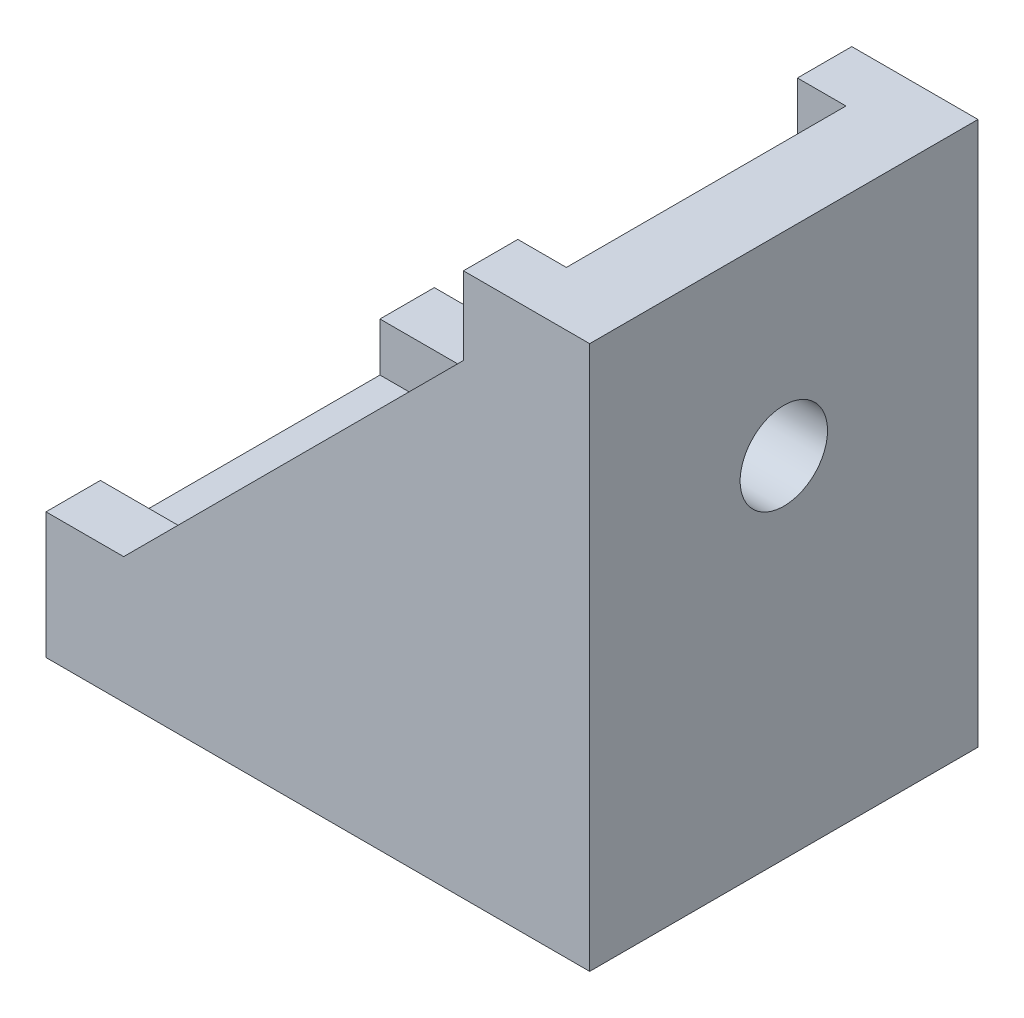
ISO-10303-21;
HEADER;
FILE_DESCRIPTION(('STEP AP214'),'2;1');
FILE_NAME('part.step','',(''),(''),'','','');
FILE_SCHEMA(('AUTOMOTIVE_DESIGN { 1 0 10303 214 1 1 1 1 }'));
ENDSEC;
DATA;
#1=APPLICATION_CONTEXT('core data for automotive mechanical design processes');
#2=APPLICATION_PROTOCOL_DEFINITION('international standard','automotive_design',2000,#1);
#3=PRODUCT_CONTEXT('',#1,'mechanical');
#4=PRODUCT('Part','Part','',(#3));
#5=PRODUCT_RELATED_PRODUCT_CATEGORY('part','',(#4));
#6=PRODUCT_DEFINITION_FORMATION('','',#4);
#7=PRODUCT_DEFINITION_CONTEXT('part definition',#1,'design');
#8=PRODUCT_DEFINITION('design','',#6,#7);
#9=PRODUCT_DEFINITION_SHAPE('','',#8);
#10=(LENGTH_UNIT() NAMED_UNIT(*) SI_UNIT(.MILLI.,.METRE.));
#11=(NAMED_UNIT(*) PLANE_ANGLE_UNIT() SI_UNIT($,.RADIAN.));
#12=(NAMED_UNIT(*) SI_UNIT($,.STERADIAN.) SOLID_ANGLE_UNIT());
#13=UNCERTAINTY_MEASURE_WITH_UNIT(LENGTH_MEASURE(1.E-05),#10,'distance_accuracy_value','');
#14=(GEOMETRIC_REPRESENTATION_CONTEXT(3) GLOBAL_UNCERTAINTY_ASSIGNED_CONTEXT((#13)) GLOBAL_UNIT_ASSIGNED_CONTEXT((#10,
#11,#12)) REPRESENTATION_CONTEXT('',''));
#15=CARTESIAN_POINT('',(0.,0.,0.));
#16=DIRECTION('',(0.,0.,1.));
#17=DIRECTION('',(1.,0.,0.));
#18=AXIS2_PLACEMENT_3D('',#15,#16,#17);
#19=CARTESIAN_POINT('',(21.5,28.,0.));
#20=DIRECTION('',(1.,0.,0.));
#21=DIRECTION('',(0.,0.,-1.));
#22=AXIS2_PLACEMENT_3D('',#19,#20,#21);
#23=PLANE('',#22);
#24=DIRECTION('',(0.,0.,1.));
#25=VECTOR('',#24,1.);
#26=CARTESIAN_POINT('',(21.5,24.0000000000001,0.));
#27=LINE('',#26,#25);
#28=CARTESIAN_POINT('',(21.5,24.0000000000001,0.));
#29=VERTEX_POINT('',#28);
#30=CARTESIAN_POINT('',(21.5,24.0000000000001,2.8));
#31=VERTEX_POINT('',#30);
#32=EDGE_CURVE('E201',#29,#31,#27,.T.);
#33=ORIENTED_EDGE('',*,*,#32,.T.);
#34=DIRECTION('',(0.,1.,0.));
#35=VECTOR('',#34,1.);
#36=CARTESIAN_POINT('',(21.5,28.,2.8));
#37=LINE('',#36,#35);
#38=CARTESIAN_POINT('',(21.5,28.,2.8));
#39=VERTEX_POINT('',#38);
#40=EDGE_CURVE('E177',#31,#39,#37,.T.);
#41=ORIENTED_EDGE('',*,*,#40,.T.);
#42=DIRECTION('',(0.,0.,1.));
#43=VECTOR('',#42,1.);
#44=CARTESIAN_POINT('',(21.5,28.,0.));
#45=LINE('',#44,#43);
#46=CARTESIAN_POINT('',(21.5,28.,0.));
#47=VERTEX_POINT('',#46);
#48=EDGE_CURVE('E196',#47,#39,#45,.T.);
#49=ORIENTED_EDGE('',*,*,#48,.F.);
#50=DIRECTION('',(0.,1.,0.));
#51=VECTOR('',#50,1.);
#52=CARTESIAN_POINT('',(21.5,28.,0.));
#53=LINE('',#52,#51);
#54=EDGE_CURVE('E186',#29,#47,#53,.T.);
#55=ORIENTED_EDGE('',*,*,#54,.F.);
#56=EDGE_LOOP('',(#33,#41,#49,#55));
#57=FACE_BOUND('',#56,.T.);
#58=ADVANCED_FACE('F36',(#57),#23,.F.);
#59=CARTESIAN_POINT('',(21.5,24.0000000000001,0.));
#60=DIRECTION('',(0.707106781186549,-0.707106781186546,0.));
#61=DIRECTION('',(0.707106781186546,0.707106781186549,0.));
#62=AXIS2_PLACEMENT_3D('',#59,#60,#61);
#63=PLANE('',#62);
#64=DIRECTION('',(0.,0.,1.));
#65=VECTOR('',#64,1.);
#66=CARTESIAN_POINT('',(4.,6.5,0.));
#67=LINE('',#66,#65);
#68=CARTESIAN_POINT('',(4.,6.5,0.));
#69=VERTEX_POINT('',#68);
#70=CARTESIAN_POINT('',(4.,6.5,2.8));
#71=VERTEX_POINT('',#70);
#72=EDGE_CURVE('E205',#69,#71,#67,.T.);
#73=ORIENTED_EDGE('',*,*,#72,.T.);
#74=DIRECTION('',(0.707106781186546,0.707106781186549,0.));
#75=VECTOR('',#74,1.);
#76=CARTESIAN_POINT('',(21.5,24.0000000000001,2.8));
#77=LINE('',#76,#75);
#78=EDGE_CURVE('E174',#71,#31,#77,.T.);
#79=ORIENTED_EDGE('',*,*,#78,.T.);
#80=ORIENTED_EDGE('',*,*,#32,.F.);
#81=DIRECTION('',(0.707106781186546,0.707106781186549,0.));
#82=VECTOR('',#81,1.);
#83=CARTESIAN_POINT('',(21.5,24.0000000000001,0.));
#84=LINE('',#83,#82);
#85=EDGE_CURVE('E61',#69,#29,#84,.T.);
#86=ORIENTED_EDGE('',*,*,#85,.F.);
#87=EDGE_LOOP('',(#73,#79,#80,#86));
#88=FACE_BOUND('',#87,.T.);
#89=ADVANCED_FACE('F278',(#88),#63,.F.);
#90=CARTESIAN_POINT('',(4.,6.5,0.));
#91=DIRECTION('',(0.,-1.,0.));
#92=DIRECTION('',(1.,0.,0.));
#93=AXIS2_PLACEMENT_3D('',#90,#91,#92);
#94=PLANE('',#93);
#95=DIRECTION('',(0.,0.,1.));
#96=VECTOR('',#95,1.);
#97=CARTESIAN_POINT('',(0.,6.5,0.));
#98=LINE('',#97,#96);
#99=CARTESIAN_POINT('',(0.,6.5,0.));
#100=VERTEX_POINT('',#99);
#101=CARTESIAN_POINT('',(0.,6.5,2.8));
#102=VERTEX_POINT('',#101);
#103=EDGE_CURVE('E208',#100,#102,#98,.T.);
#104=ORIENTED_EDGE('',*,*,#103,.T.);
#105=DIRECTION('',(1.,0.,0.));
#106=VECTOR('',#105,1.);
#107=CARTESIAN_POINT('',(4.,6.5,2.8));
#108=LINE('',#107,#106);
#109=EDGE_CURVE('E11',#102,#71,#108,.T.);
#110=ORIENTED_EDGE('',*,*,#109,.T.);
#111=ORIENTED_EDGE('',*,*,#72,.F.);
#112=DIRECTION('',(1.,0.,0.));
#113=VECTOR('',#112,1.);
#114=CARTESIAN_POINT('',(4.,6.5,0.));
#115=LINE('',#114,#113);
#116=EDGE_CURVE('E181',#100,#69,#115,.T.);
#117=ORIENTED_EDGE('',*,*,#116,.F.);
#118=EDGE_LOOP('',(#104,#110,#111,#117));
#119=FACE_BOUND('',#118,.T.);
#120=ADVANCED_FACE('F276',(#119),#94,.F.);
#121=CARTESIAN_POINT('',(0.,0.,20.));
#122=DIRECTION('',(1.,0.,0.));
#123=DIRECTION('',(0.,0.,-1.));
#124=AXIS2_PLACEMENT_3D('',#121,#122,#123);
#125=PLANE('',#124);
#126=DIRECTION('',(0.,0.,1.));
#127=VECTOR('',#126,1.);
#128=CARTESIAN_POINT('',(0.,4.,2.8));
#129=LINE('',#128,#127);
#130=CARTESIAN_POINT('',(0.,4.,2.8));
#131=VERTEX_POINT('',#130);
#132=CARTESIAN_POINT('',(0.,4.,17.2));
#133=VERTEX_POINT('',#132);
#134=EDGE_CURVE('E147',#131,#133,#129,.T.);
#135=ORIENTED_EDGE('',*,*,#134,.F.);
#136=DIRECTION('',(0.,1.,0.));
#137=VECTOR('',#136,1.);
#138=CARTESIAN_POINT('',(0.,4.,2.8));
#139=LINE('',#138,#137);
#140=EDGE_CURVE('E171',#131,#102,#139,.T.);
#141=ORIENTED_EDGE('',*,*,#140,.T.);
#142=ORIENTED_EDGE('',*,*,#103,.F.);
#143=DIRECTION('',(0.,-1.,0.));
#144=VECTOR('',#143,1.);
#145=CARTESIAN_POINT('',(0.,0.,0.));
#146=LINE('',#145,#144);
#147=CARTESIAN_POINT('',(0.,0.,0.));
#148=VERTEX_POINT('',#147);
#149=EDGE_CURVE('E199',#100,#148,#146,.T.);
#150=ORIENTED_EDGE('',*,*,#149,.T.);
#151=DIRECTION('',(0.,0.,-1.));
#152=VECTOR('',#151,1.);
#153=CARTESIAN_POINT('',(0.,0.,20.));
#154=LINE('',#153,#152);
#155=CARTESIAN_POINT('',(0.,0.,20.));
#156=VERTEX_POINT('',#155);
#157=EDGE_CURVE('E234',#156,#148,#154,.T.);
#158=ORIENTED_EDGE('',*,*,#157,.F.);
#159=DIRECTION('',(0.,-1.,0.));
#160=VECTOR('',#159,1.);
#161=CARTESIAN_POINT('',(0.,0.,20.));
#162=LINE('',#161,#160);
#163=CARTESIAN_POINT('',(0.,6.5,20.));
#164=VERTEX_POINT('',#163);
#165=EDGE_CURVE('E211',#164,#156,#162,.T.);
#166=ORIENTED_EDGE('',*,*,#165,.F.);
#167=CARTESIAN_POINT('',(0.,6.5,17.2));
#168=VERTEX_POINT('',#167);
#169=EDGE_CURVE('E160',#168,#164,#98,.T.);
#170=ORIENTED_EDGE('',*,*,#169,.F.);
#171=DIRECTION('',(0.,1.,0.));
#172=VECTOR('',#171,1.);
#173=CARTESIAN_POINT('',(0.,4.,17.2));
#174=LINE('',#173,#172);
#175=EDGE_CURVE('E53',#133,#168,#174,.T.);
#176=ORIENTED_EDGE('',*,*,#175,.F.);
#177=EDGE_LOOP('',(#135,#141,#142,#150,#158,#166,#170,#176));
#178=FACE_BOUND('',#177,.T.);
#179=ADVANCED_FACE('F38',(#178),#125,.F.);
#180=CARTESIAN_POINT('',(0.,0.,20.));
#181=DIRECTION('',(0.,1.,0.));
#182=DIRECTION('',(0.,0.,1.));
#183=AXIS2_PLACEMENT_3D('',#180,#181,#182);
#184=PLANE('',#183);
#185=CARTESIAN_POINT('',(10.,0.,10.));
#186=DIRECTION('',(0.,-1.,0.));
#187=DIRECTION('',(0.,0.,-1.));
#188=AXIS2_PLACEMENT_3D('',#185,#186,#187);
#189=CIRCLE('',#188,2.25);
#190=CARTESIAN_POINT('',(10.,0.,7.75));
#191=VERTEX_POINT('',#190);
#192=EDGE_CURVE('E240',#191,#191,#189,.T.);
#193=ORIENTED_EDGE('',*,*,#192,.F.);
#194=EDGE_LOOP('',(#193));
#195=FACE_BOUND('',#194,.T.);
#196=DIRECTION('',(1.,0.,0.));
#197=VECTOR('',#196,1.);
#198=CARTESIAN_POINT('',(0.,0.,0.));
#199=LINE('',#198,#197);
#200=CARTESIAN_POINT('',(28.,0.,0.));
#201=VERTEX_POINT('',#200);
#202=EDGE_CURVE('E223',#148,#201,#199,.T.);
#203=ORIENTED_EDGE('',*,*,#202,.T.);
#204=DIRECTION('',(0.,0.,-1.));
#205=VECTOR('',#204,1.);
#206=CARTESIAN_POINT('',(28.,0.,20.));
#207=LINE('',#206,#205);
#208=CARTESIAN_POINT('',(28.,0.,20.));
#209=VERTEX_POINT('',#208);
#210=EDGE_CURVE('E231',#209,#201,#207,.T.);
#211=ORIENTED_EDGE('',*,*,#210,.F.);
#212=DIRECTION('',(1.,0.,0.));
#213=VECTOR('',#212,1.);
#214=CARTESIAN_POINT('',(0.,0.,20.));
#215=LINE('',#214,#213);
#216=EDGE_CURVE('E213',#156,#209,#215,.T.);
#217=ORIENTED_EDGE('',*,*,#216,.F.);
#218=ORIENTED_EDGE('',*,*,#157,.T.);
#219=EDGE_LOOP('',(#203,#211,#217,#218));
#220=FACE_BOUND('',#219,.T.);
#221=ADVANCED_FACE('F313',(#195,#220),#184,.F.);
#222=CARTESIAN_POINT('',(28.,0.,20.));
#223=DIRECTION('',(-1.,0.,0.));
#224=DIRECTION('',(0.,0.,1.));
#225=AXIS2_PLACEMENT_3D('',#222,#223,#224);
#226=PLANE('',#225);
#227=CARTESIAN_POINT('',(28.,18.,10.));
#228=DIRECTION('',(1.,0.,0.));
#229=DIRECTION('',(0.,0.,-1.));
#230=AXIS2_PLACEMENT_3D('',#227,#228,#229);
#231=CIRCLE('',#230,2.25);
#232=CARTESIAN_POINT('',(28.,18.,7.75));
#233=VERTEX_POINT('',#232);
#234=EDGE_CURVE('E250',#233,#233,#231,.T.);
#235=ORIENTED_EDGE('',*,*,#234,.F.);
#236=EDGE_LOOP('',(#235));
#237=FACE_BOUND('',#236,.T.);
#238=DIRECTION('',(0.,1.,0.));
#239=VECTOR('',#238,1.);
#240=CARTESIAN_POINT('',(28.,0.,0.));
#241=LINE('',#240,#239);
#242=CARTESIAN_POINT('',(28.,28.,0.));
#243=VERTEX_POINT('',#242);
#244=EDGE_CURVE('E225',#201,#243,#241,.T.);
#245=ORIENTED_EDGE('',*,*,#244,.T.);
#246=DIRECTION('',(0.,0.,-1.));
#247=VECTOR('',#246,1.);
#248=CARTESIAN_POINT('',(28.,28.,20.));
#249=LINE('',#248,#247);
#250=CARTESIAN_POINT('',(28.,28.,20.));
#251=VERTEX_POINT('',#250);
#252=EDGE_CURVE('E221',#251,#243,#249,.T.);
#253=ORIENTED_EDGE('',*,*,#252,.F.);
#254=DIRECTION('',(0.,1.,0.));
#255=VECTOR('',#254,1.);
#256=CARTESIAN_POINT('',(28.,0.,20.));
#257=LINE('',#256,#255);
#258=EDGE_CURVE('E216',#209,#251,#257,.T.);
#259=ORIENTED_EDGE('',*,*,#258,.F.);
#260=ORIENTED_EDGE('',*,*,#210,.T.);
#261=EDGE_LOOP('',(#245,#253,#259,#260));
#262=FACE_BOUND('',#261,.T.);
#263=ADVANCED_FACE('F311',(#237,#262),#226,.F.);
#264=CARTESIAN_POINT('',(0.,28.,20.));
#265=DIRECTION('',(0.,-1.,0.));
#266=DIRECTION('',(0.,0.,-1.));
#267=AXIS2_PLACEMENT_3D('',#264,#265,#266);
#268=PLANE('',#267);
#269=ORIENTED_EDGE('',*,*,#48,.T.);
#270=DIRECTION('',(-1.,0.,0.));
#271=VECTOR('',#270,1.);
#272=CARTESIAN_POINT('',(0.,28.,2.8));
#273=LINE('',#272,#271);
#274=CARTESIAN_POINT('',(24.,28.,2.8));
#275=VERTEX_POINT('',#274);
#276=EDGE_CURVE('E156',#275,#39,#273,.T.);
#277=ORIENTED_EDGE('',*,*,#276,.F.);
#278=DIRECTION('',(0.,0.,-1.));
#279=VECTOR('',#278,1.);
#280=CARTESIAN_POINT('',(24.,28.,2.8));
#281=LINE('',#280,#279);
#282=CARTESIAN_POINT('',(24.,28.,17.2));
#283=VERTEX_POINT('',#282);
#284=EDGE_CURVE('E243',#283,#275,#281,.T.);
#285=ORIENTED_EDGE('',*,*,#284,.F.);
#286=DIRECTION('',(1.,0.,0.));
#287=VECTOR('',#286,1.);
#288=CARTESIAN_POINT('',(0.,28.,17.2));
#289=LINE('',#288,#287);
#290=CARTESIAN_POINT('',(21.5,28.,17.2));
#291=VERTEX_POINT('',#290);
#292=EDGE_CURVE('E239',#291,#283,#289,.T.);
#293=ORIENTED_EDGE('',*,*,#292,.F.);
#294=CARTESIAN_POINT('',(21.5,28.,20.));
#295=VERTEX_POINT('',#294);
#296=EDGE_CURVE('E200',#291,#295,#45,.T.);
#297=ORIENTED_EDGE('',*,*,#296,.T.);
#298=DIRECTION('',(-1.,0.,0.));
#299=VECTOR('',#298,1.);
#300=CARTESIAN_POINT('',(0.,28.,20.));
#301=LINE('',#300,#299);
#302=EDGE_CURVE('E218',#251,#295,#301,.T.);
#303=ORIENTED_EDGE('',*,*,#302,.F.);
#304=ORIENTED_EDGE('',*,*,#252,.T.);
#305=DIRECTION('',(-1.,0.,0.));
#306=VECTOR('',#305,1.);
#307=CARTESIAN_POINT('',(0.,28.,0.));
#308=LINE('',#307,#306);
#309=EDGE_CURVE('E214',#243,#47,#308,.T.);
#310=ORIENTED_EDGE('',*,*,#309,.T.);
#311=EDGE_LOOP('',(#269,#277,#285,#293,#297,#303,#304,#310));
#312=FACE_BOUND('',#311,.T.);
#313=ADVANCED_FACE('F265',(#312),#268,.F.);
#314=CARTESIAN_POINT('',(0.,0.,20.));
#315=DIRECTION('',(0.,0.,-1.));
#316=DIRECTION('',(-1.,0.,0.));
#317=AXIS2_PLACEMENT_3D('',#314,#315,#316);
#318=PLANE('',#317);
#319=ORIENTED_EDGE('',*,*,#302,.T.);
#320=DIRECTION('',(0.,1.,0.));
#321=VECTOR('',#320,1.);
#322=CARTESIAN_POINT('',(21.5,28.,20.));
#323=LINE('',#322,#321);
#324=CARTESIAN_POINT('',(21.5,24.0000000000001,20.));
#325=VERTEX_POINT('',#324);
#326=EDGE_CURVE('E184',#325,#295,#323,.T.);
#327=ORIENTED_EDGE('',*,*,#326,.F.);
#328=DIRECTION('',(0.707106781186546,0.707106781186549,0.));
#329=VECTOR('',#328,1.);
#330=CARTESIAN_POINT('',(21.5,24.0000000000001,20.));
#331=LINE('',#330,#329);
#332=CARTESIAN_POINT('',(4.,6.5,20.));
#333=VERTEX_POINT('',#332);
#334=EDGE_CURVE('E191',#333,#325,#331,.T.);
#335=ORIENTED_EDGE('',*,*,#334,.F.);
#336=DIRECTION('',(1.,0.,0.));
#337=VECTOR('',#336,1.);
#338=CARTESIAN_POINT('',(4.,6.5,20.));
#339=LINE('',#338,#337);
#340=EDGE_CURVE('E180',#164,#333,#339,.T.);
#341=ORIENTED_EDGE('',*,*,#340,.F.);
#342=ORIENTED_EDGE('',*,*,#165,.T.);
#343=ORIENTED_EDGE('',*,*,#216,.T.);
#344=ORIENTED_EDGE('',*,*,#258,.T.);
#345=EDGE_LOOP('',(#319,#327,#335,#341,#342,#343,#344));
#346=FACE_BOUND('',#345,.T.);
#347=ADVANCED_FACE('F306',(#346),#318,.F.);
#348=CARTESIAN_POINT('',(0.,0.,0.));
#349=DIRECTION('',(0.,0.,-1.));
#350=DIRECTION('',(-1.,0.,0.));
#351=AXIS2_PLACEMENT_3D('',#348,#349,#350);
#352=PLANE('',#351);
#353=ORIENTED_EDGE('',*,*,#54,.T.);
#354=ORIENTED_EDGE('',*,*,#309,.F.);
#355=ORIENTED_EDGE('',*,*,#244,.F.);
#356=ORIENTED_EDGE('',*,*,#202,.F.);
#357=ORIENTED_EDGE('',*,*,#149,.F.);
#358=ORIENTED_EDGE('',*,*,#116,.T.);
#359=ORIENTED_EDGE('',*,*,#85,.T.);
#360=EDGE_LOOP('',(#353,#354,#355,#356,#357,#358,#359));
#361=FACE_BOUND('',#360,.T.);
#362=ADVANCED_FACE('F270',(#361),#352,.T.);
#363=ORIENTED_EDGE('',*,*,#296,.F.);
#364=DIRECTION('',(0.,-1.,0.));
#365=VECTOR('',#364,1.);
#366=CARTESIAN_POINT('',(21.5,28.,17.2));
#367=LINE('',#366,#365);
#368=CARTESIAN_POINT('',(21.5,24.0000000000001,17.2));
#369=VERTEX_POINT('',#368);
#370=EDGE_CURVE('E170',#291,#369,#367,.T.);
#371=ORIENTED_EDGE('',*,*,#370,.T.);
#372=EDGE_CURVE('E204',#369,#325,#27,.T.);
#373=ORIENTED_EDGE('',*,*,#372,.T.);
#374=ORIENTED_EDGE('',*,*,#326,.T.);
#375=EDGE_LOOP('',(#363,#371,#373,#374));
#376=FACE_BOUND('',#375,.T.);
#377=ADVANCED_FACE('F289',(#376),#23,.F.);
#378=ORIENTED_EDGE('',*,*,#372,.F.);
#379=DIRECTION('',(-0.707106781186546,-0.707106781186549,0.));
#380=VECTOR('',#379,1.);
#381=CARTESIAN_POINT('',(21.5,24.0000000000001,17.2));
#382=LINE('',#381,#380);
#383=CARTESIAN_POINT('',(4.,6.5,17.2));
#384=VERTEX_POINT('',#383);
#385=EDGE_CURVE('E167',#369,#384,#382,.T.);
#386=ORIENTED_EDGE('',*,*,#385,.T.);
#387=EDGE_CURVE('E207',#384,#333,#67,.T.);
#388=ORIENTED_EDGE('',*,*,#387,.T.);
#389=ORIENTED_EDGE('',*,*,#334,.T.);
#390=EDGE_LOOP('',(#378,#386,#388,#389));
#391=FACE_BOUND('',#390,.T.);
#392=ADVANCED_FACE('F281',(#391),#63,.F.);
#393=ORIENTED_EDGE('',*,*,#387,.F.);
#394=DIRECTION('',(-1.,0.,0.));
#395=VECTOR('',#394,1.);
#396=CARTESIAN_POINT('',(4.,6.5,17.2));
#397=LINE('',#396,#395);
#398=EDGE_CURVE('E45',#384,#168,#397,.T.);
#399=ORIENTED_EDGE('',*,*,#398,.T.);
#400=ORIENTED_EDGE('',*,*,#169,.T.);
#401=ORIENTED_EDGE('',*,*,#340,.T.);
#402=EDGE_LOOP('',(#393,#399,#400,#401));
#403=FACE_BOUND('',#402,.T.);
#404=ADVANCED_FACE('F287',(#403),#94,.F.);
#405=CARTESIAN_POINT('',(0.,4.,2.8));
#406=DIRECTION('',(0.,0.,-1.));
#407=DIRECTION('',(-1.,0.,0.));
#408=AXIS2_PLACEMENT_3D('',#405,#406,#407);
#409=PLANE('',#408);
#410=ORIENTED_EDGE('',*,*,#78,.F.);
#411=ORIENTED_EDGE('',*,*,#109,.F.);
#412=ORIENTED_EDGE('',*,*,#140,.F.);
#413=DIRECTION('',(-1.,0.,0.));
#414=VECTOR('',#413,1.);
#415=CARTESIAN_POINT('',(0.,4.,2.8));
#416=LINE('',#415,#414);
#417=CARTESIAN_POINT('',(24.,4.,2.8));
#418=VERTEX_POINT('',#417);
#419=EDGE_CURVE('E153',#418,#131,#416,.T.);
#420=ORIENTED_EDGE('',*,*,#419,.F.);
#421=DIRECTION('',(0.,1.,0.));
#422=VECTOR('',#421,1.);
#423=CARTESIAN_POINT('',(24.,4.,2.8));
#424=LINE('',#423,#422);
#425=EDGE_CURVE('E162',#418,#275,#424,.T.);
#426=ORIENTED_EDGE('',*,*,#425,.T.);
#427=ORIENTED_EDGE('',*,*,#276,.T.);
#428=ORIENTED_EDGE('',*,*,#40,.F.);
#429=EDGE_LOOP('',(#410,#411,#412,#420,#426,#427,#428));
#430=FACE_BOUND('',#429,.T.);
#431=ADVANCED_FACE('F258',(#430),#409,.F.);
#432=CARTESIAN_POINT('',(0.,4.,17.2));
#433=DIRECTION('',(0.,0.,1.));
#434=DIRECTION('',(1.,0.,0.));
#435=AXIS2_PLACEMENT_3D('',#432,#433,#434);
#436=PLANE('',#435);
#437=ORIENTED_EDGE('',*,*,#292,.T.);
#438=DIRECTION('',(0.,1.,0.));
#439=VECTOR('',#438,1.);
#440=CARTESIAN_POINT('',(24.,4.,17.2));
#441=LINE('',#440,#439);
#442=CARTESIAN_POINT('',(24.,4.,17.2));
#443=VERTEX_POINT('',#442);
#444=EDGE_CURVE('E142',#443,#283,#441,.T.);
#445=ORIENTED_EDGE('',*,*,#444,.F.);
#446=DIRECTION('',(1.,0.,0.));
#447=VECTOR('',#446,1.);
#448=CARTESIAN_POINT('',(0.,4.,17.2));
#449=LINE('',#448,#447);
#450=EDGE_CURVE('E138',#133,#443,#449,.T.);
#451=ORIENTED_EDGE('',*,*,#450,.F.);
#452=ORIENTED_EDGE('',*,*,#175,.T.);
#453=ORIENTED_EDGE('',*,*,#398,.F.);
#454=ORIENTED_EDGE('',*,*,#385,.F.);
#455=ORIENTED_EDGE('',*,*,#370,.F.);
#456=EDGE_LOOP('',(#437,#445,#451,#452,#453,#454,#455));
#457=FACE_BOUND('',#456,.T.);
#458=ADVANCED_FACE('F140',(#457),#436,.F.);
#459=CARTESIAN_POINT('',(24.,4.,2.8));
#460=DIRECTION('',(1.,0.,0.));
#461=DIRECTION('',(0.,0.,-1.));
#462=AXIS2_PLACEMENT_3D('',#459,#460,#461);
#463=PLANE('',#462);
#464=CARTESIAN_POINT('',(24.,18.,10.));
#465=DIRECTION('',(1.,0.,0.));
#466=DIRECTION('',(0.,0.,-1.));
#467=AXIS2_PLACEMENT_3D('',#464,#465,#466);
#468=CIRCLE('',#467,2.25);
#469=CARTESIAN_POINT('',(24.,18.,7.75));
#470=VERTEX_POINT('',#469);
#471=EDGE_CURVE('E40',#470,#470,#468,.T.);
#472=ORIENTED_EDGE('',*,*,#471,.T.);
#473=EDGE_LOOP('',(#472));
#474=FACE_BOUND('',#473,.T.);
#475=ORIENTED_EDGE('',*,*,#284,.T.);
#476=ORIENTED_EDGE('',*,*,#425,.F.);
#477=DIRECTION('',(0.,0.,-1.));
#478=VECTOR('',#477,1.);
#479=CARTESIAN_POINT('',(24.,4.,2.8));
#480=LINE('',#479,#478);
#481=EDGE_CURVE('E146',#443,#418,#480,.T.);
#482=ORIENTED_EDGE('',*,*,#481,.F.);
#483=ORIENTED_EDGE('',*,*,#444,.T.);
#484=EDGE_LOOP('',(#475,#476,#482,#483));
#485=FACE_BOUND('',#484,.T.);
#486=ADVANCED_FACE('F262',(#474,#485),#463,.F.);
#487=CARTESIAN_POINT('',(0.,4.,0.));
#488=DIRECTION('',(0.,1.,0.));
#489=DIRECTION('',(0.,0.,1.));
#490=AXIS2_PLACEMENT_3D('',#487,#488,#489);
#491=PLANE('',#490);
#492=CARTESIAN_POINT('',(10.,4.,10.));
#493=DIRECTION('',(0.,1.,0.));
#494=DIRECTION('',(0.,0.,1.));
#495=AXIS2_PLACEMENT_3D('',#492,#493,#494);
#496=CIRCLE('',#495,2.25);
#497=CARTESIAN_POINT('',(10.,4.,12.25));
#498=VERTEX_POINT('',#497);
#499=EDGE_CURVE('E237',#498,#498,#496,.T.);
#500=ORIENTED_EDGE('',*,*,#499,.F.);
#501=EDGE_LOOP('',(#500));
#502=FACE_BOUND('',#501,.T.);
#503=ORIENTED_EDGE('',*,*,#134,.T.);
#504=ORIENTED_EDGE('',*,*,#450,.T.);
#505=ORIENTED_EDGE('',*,*,#481,.T.);
#506=ORIENTED_EDGE('',*,*,#419,.T.);
#507=EDGE_LOOP('',(#503,#504,#505,#506));
#508=FACE_BOUND('',#507,.T.);
#509=ADVANCED_FACE('F151',(#502,#508),#491,.T.);
#510=CARTESIAN_POINT('',(10.,10.,10.));
#511=DIRECTION('',(0.,-1.,0.));
#512=DIRECTION('',(0.,0.,-1.));
#513=AXIS2_PLACEMENT_3D('',#510,#511,#512);
#514=CYLINDRICAL_SURFACE('',#513,2.25);
#515=ORIENTED_EDGE('',*,*,#499,.T.);
#516=EDGE_LOOP('',(#515));
#517=FACE_BOUND('',#516,.T.);
#518=ORIENTED_EDGE('',*,*,#192,.T.);
#519=EDGE_LOOP('',(#518));
#520=FACE_BOUND('',#519,.T.);
#521=ADVANCED_FACE('F393',(#517,#520),#514,.F.);
#522=CARTESIAN_POINT('',(18.,18.,10.));
#523=DIRECTION('',(1.,0.,0.));
#524=DIRECTION('',(0.,0.,-1.));
#525=AXIS2_PLACEMENT_3D('',#522,#523,#524);
#526=CYLINDRICAL_SURFACE('',#525,2.25);
#527=ORIENTED_EDGE('',*,*,#234,.T.);
#528=EDGE_LOOP('',(#527));
#529=FACE_BOUND('',#528,.T.);
#530=ORIENTED_EDGE('',*,*,#471,.F.);
#531=EDGE_LOOP('',(#530));
#532=FACE_BOUND('',#531,.T.);
#533=ADVANCED_FACE('F403',(#529,#532),#526,.F.);
#534=CLOSED_SHELL('',(#58,#89,#120,#179,#221,#263,#313,#347,#362,#377,#392,#404,#431,#458,#486,
#509,#521,#533));
#535=MANIFOLD_SOLID_BREP('B2',#534);
#536=ADVANCED_BREP_SHAPE_REPRESENTATION('',(#18,#535),#14);
#537=SHAPE_DEFINITION_REPRESENTATION(#9,#536);
ENDSEC;
END-ISO-10303-21;
